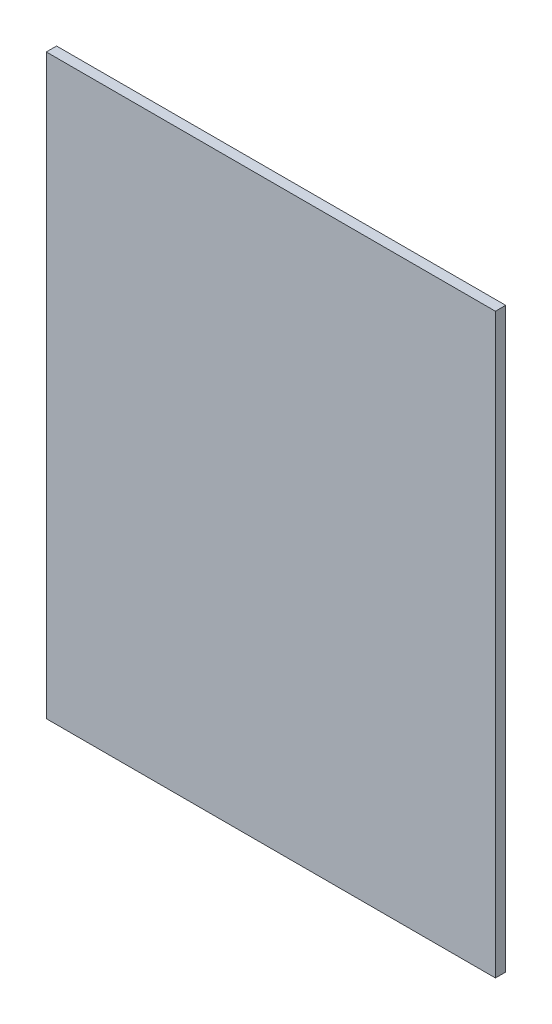
ISO-10303-21;
HEADER;
FILE_DESCRIPTION(('STEP AP214'),'2;1');
FILE_NAME('part.step','',(''),(''),'','','');
FILE_SCHEMA(('AUTOMOTIVE_DESIGN { 1 0 10303 214 1 1 1 1 }'));
ENDSEC;
DATA;
#1=APPLICATION_CONTEXT('core data for automotive mechanical design processes');
#2=APPLICATION_PROTOCOL_DEFINITION('international standard','automotive_design',2000,#1);
#3=PRODUCT_CONTEXT('',#1,'mechanical');
#4=PRODUCT('Part','Part','',(#3));
#5=PRODUCT_RELATED_PRODUCT_CATEGORY('part','',(#4));
#6=PRODUCT_DEFINITION_FORMATION('','',#4);
#7=PRODUCT_DEFINITION_CONTEXT('part definition',#1,'design');
#8=PRODUCT_DEFINITION('design','',#6,#7);
#9=PRODUCT_DEFINITION_SHAPE('','',#8);
#10=(LENGTH_UNIT() NAMED_UNIT(*) SI_UNIT(.MILLI.,.METRE.));
#11=(NAMED_UNIT(*) PLANE_ANGLE_UNIT() SI_UNIT($,.RADIAN.));
#12=(NAMED_UNIT(*) SI_UNIT($,.STERADIAN.) SOLID_ANGLE_UNIT());
#13=UNCERTAINTY_MEASURE_WITH_UNIT(LENGTH_MEASURE(1.E-05),#10,'distance_accuracy_value','');
#14=(GEOMETRIC_REPRESENTATION_CONTEXT(3) GLOBAL_UNCERTAINTY_ASSIGNED_CONTEXT((#13)) GLOBAL_UNIT_ASSIGNED_CONTEXT((#10,
#11,#12)) REPRESENTATION_CONTEXT('',''));
#15=CARTESIAN_POINT('',(0.,0.,0.));
#16=DIRECTION('',(0.,0.,1.));
#17=DIRECTION('',(1.,0.,0.));
#18=AXIS2_PLACEMENT_3D('',#15,#16,#17);
#19=CARTESIAN_POINT('',(35.,-12.5,10.6));
#20=DIRECTION('',(-1.,0.,0.));
#21=DIRECTION('',(0.,0.,1.));
#22=AXIS2_PLACEMENT_3D('',#19,#20,#21);
#23=PLANE('',#22);
#24=DIRECTION('',(0.,1.,0.));
#25=VECTOR('',#24,1.);
#26=CARTESIAN_POINT('',(35.,-12.5,9.));
#27=LINE('',#26,#25);
#28=CARTESIAN_POINT('',(35.,-12.5,9.));
#29=VERTEX_POINT('',#28);
#30=CARTESIAN_POINT('',(35.,77.5,9.));
#31=VERTEX_POINT('',#30);
#32=EDGE_CURVE('E102',#29,#31,#27,.T.);
#33=ORIENTED_EDGE('',*,*,#32,.T.);
#34=DIRECTION('',(0.,0.,-1.));
#35=VECTOR('',#34,1.);
#36=CARTESIAN_POINT('',(35.,77.5,10.6));
#37=LINE('',#36,#35);
#38=CARTESIAN_POINT('',(35.,77.5,10.6));
#39=VERTEX_POINT('',#38);
#40=EDGE_CURVE('E11',#39,#31,#37,.T.);
#41=ORIENTED_EDGE('',*,*,#40,.F.);
#42=DIRECTION('',(0.,1.,0.));
#43=VECTOR('',#42,1.);
#44=CARTESIAN_POINT('',(35.,-12.5,10.6));
#45=LINE('',#44,#43);
#46=CARTESIAN_POINT('',(35.,-12.5,10.6));
#47=VERTEX_POINT('',#46);
#48=EDGE_CURVE('E90',#47,#39,#45,.T.);
#49=ORIENTED_EDGE('',*,*,#48,.F.);
#50=DIRECTION('',(0.,0.,-1.));
#51=VECTOR('',#50,1.);
#52=CARTESIAN_POINT('',(35.,-12.5,10.6));
#53=LINE('',#52,#51);
#54=EDGE_CURVE('E98',#47,#29,#53,.T.);
#55=ORIENTED_EDGE('',*,*,#54,.T.);
#56=EDGE_LOOP('',(#33,#41,#49,#55));
#57=FACE_BOUND('',#56,.T.);
#58=ADVANCED_FACE('F39',(#57),#23,.F.);
#59=CARTESIAN_POINT('',(-35.,77.5,10.6));
#60=DIRECTION('',(0.,-1.,0.));
#61=DIRECTION('',(0.,0.,-1.));
#62=AXIS2_PLACEMENT_3D('',#59,#60,#61);
#63=PLANE('',#62);
#64=DIRECTION('',(-1.,0.,0.));
#65=VECTOR('',#64,1.);
#66=CARTESIAN_POINT('',(-35.,77.5,9.));
#67=LINE('',#66,#65);
#68=CARTESIAN_POINT('',(-35.,77.5,9.));
#69=VERTEX_POINT('',#68);
#70=EDGE_CURVE('E94',#31,#69,#67,.T.);
#71=ORIENTED_EDGE('',*,*,#70,.T.);
#72=DIRECTION('',(0.,0.,-1.));
#73=VECTOR('',#72,1.);
#74=CARTESIAN_POINT('',(-35.,77.5,10.6));
#75=LINE('',#74,#73);
#76=CARTESIAN_POINT('',(-35.,77.5,10.6));
#77=VERTEX_POINT('',#76);
#78=EDGE_CURVE('E47',#77,#69,#75,.T.);
#79=ORIENTED_EDGE('',*,*,#78,.F.);
#80=DIRECTION('',(-1.,0.,0.));
#81=VECTOR('',#80,1.);
#82=CARTESIAN_POINT('',(-35.,77.5,10.6));
#83=LINE('',#82,#81);
#84=EDGE_CURVE('E85',#39,#77,#83,.T.);
#85=ORIENTED_EDGE('',*,*,#84,.F.);
#86=ORIENTED_EDGE('',*,*,#40,.T.);
#87=EDGE_LOOP('',(#71,#79,#85,#86));
#88=FACE_BOUND('',#87,.T.);
#89=ADVANCED_FACE('F93',(#88),#63,.F.);
#90=CARTESIAN_POINT('',(-35.,-12.5,10.6));
#91=DIRECTION('',(1.,0.,0.));
#92=DIRECTION('',(0.,0.,-1.));
#93=AXIS2_PLACEMENT_3D('',#90,#91,#92);
#94=PLANE('',#93);
#95=DIRECTION('',(0.,-1.,0.));
#96=VECTOR('',#95,1.);
#97=CARTESIAN_POINT('',(-35.,-12.5,9.));
#98=LINE('',#97,#96);
#99=CARTESIAN_POINT('',(-35.,-12.5,9.));
#100=VERTEX_POINT('',#99);
#101=EDGE_CURVE('E72',#69,#100,#98,.T.);
#102=ORIENTED_EDGE('',*,*,#101,.T.);
#103=DIRECTION('',(0.,0.,-1.));
#104=VECTOR('',#103,1.);
#105=CARTESIAN_POINT('',(-35.,-12.5,10.6));
#106=LINE('',#105,#104);
#107=CARTESIAN_POINT('',(-35.,-12.5,10.6));
#108=VERTEX_POINT('',#107);
#109=EDGE_CURVE('E95',#108,#100,#106,.T.);
#110=ORIENTED_EDGE('',*,*,#109,.F.);
#111=DIRECTION('',(0.,-1.,0.));
#112=VECTOR('',#111,1.);
#113=CARTESIAN_POINT('',(-35.,-12.5,10.6));
#114=LINE('',#113,#112);
#115=EDGE_CURVE('E88',#77,#108,#114,.T.);
#116=ORIENTED_EDGE('',*,*,#115,.F.);
#117=ORIENTED_EDGE('',*,*,#78,.T.);
#118=EDGE_LOOP('',(#102,#110,#116,#117));
#119=FACE_BOUND('',#118,.T.);
#120=ADVANCED_FACE('F96',(#119),#94,.F.);
#121=CARTESIAN_POINT('',(-35.,-12.5,10.6));
#122=DIRECTION('',(0.,1.,0.));
#123=DIRECTION('',(0.,0.,1.));
#124=AXIS2_PLACEMENT_3D('',#121,#122,#123);
#125=PLANE('',#124);
#126=DIRECTION('',(1.,0.,0.));
#127=VECTOR('',#126,1.);
#128=CARTESIAN_POINT('',(-35.,-12.5,9.));
#129=LINE('',#128,#127);
#130=EDGE_CURVE('E78',#100,#29,#129,.T.);
#131=ORIENTED_EDGE('',*,*,#130,.T.);
#132=ORIENTED_EDGE('',*,*,#54,.F.);
#133=DIRECTION('',(1.,0.,0.));
#134=VECTOR('',#133,1.);
#135=CARTESIAN_POINT('',(-35.,-12.5,10.6));
#136=LINE('',#135,#134);
#137=EDGE_CURVE('E55',#108,#47,#136,.T.);
#138=ORIENTED_EDGE('',*,*,#137,.F.);
#139=ORIENTED_EDGE('',*,*,#109,.T.);
#140=EDGE_LOOP('',(#131,#132,#138,#139));
#141=FACE_BOUND('',#140,.T.);
#142=ADVANCED_FACE('F109',(#141),#125,.F.);
#143=CARTESIAN_POINT('',(0.,0.,10.6));
#144=DIRECTION('',(0.,0.,-1.));
#145=DIRECTION('',(-1.,0.,0.));
#146=AXIS2_PLACEMENT_3D('',#143,#144,#145);
#147=PLANE('',#146);
#148=ORIENTED_EDGE('',*,*,#48,.T.);
#149=ORIENTED_EDGE('',*,*,#84,.T.);
#150=ORIENTED_EDGE('',*,*,#115,.T.);
#151=ORIENTED_EDGE('',*,*,#137,.T.);
#152=EDGE_LOOP('',(#148,#149,#150,#151));
#153=FACE_BOUND('',#152,.T.);
#154=ADVANCED_FACE('F86',(#153),#147,.F.);
#155=CARTESIAN_POINT('',(0.,0.,9.));
#156=DIRECTION('',(0.,0.,-1.));
#157=DIRECTION('',(-1.,0.,0.));
#158=AXIS2_PLACEMENT_3D('',#155,#156,#157);
#159=PLANE('',#158);
#160=ORIENTED_EDGE('',*,*,#32,.F.);
#161=ORIENTED_EDGE('',*,*,#130,.F.);
#162=ORIENTED_EDGE('',*,*,#101,.F.);
#163=ORIENTED_EDGE('',*,*,#70,.F.);
#164=EDGE_LOOP('',(#160,#161,#162,#163));
#165=FACE_BOUND('',#164,.T.);
#166=ADVANCED_FACE('F112',(#165),#159,.T.);
#167=CLOSED_SHELL('',(#58,#89,#120,#142,#154,#166));
#168=MANIFOLD_SOLID_BREP('B2',#167);
#169=ADVANCED_BREP_SHAPE_REPRESENTATION('',(#18,#168),#14);
#170=SHAPE_DEFINITION_REPRESENTATION(#9,#169);
ENDSEC;
END-ISO-10303-21;
